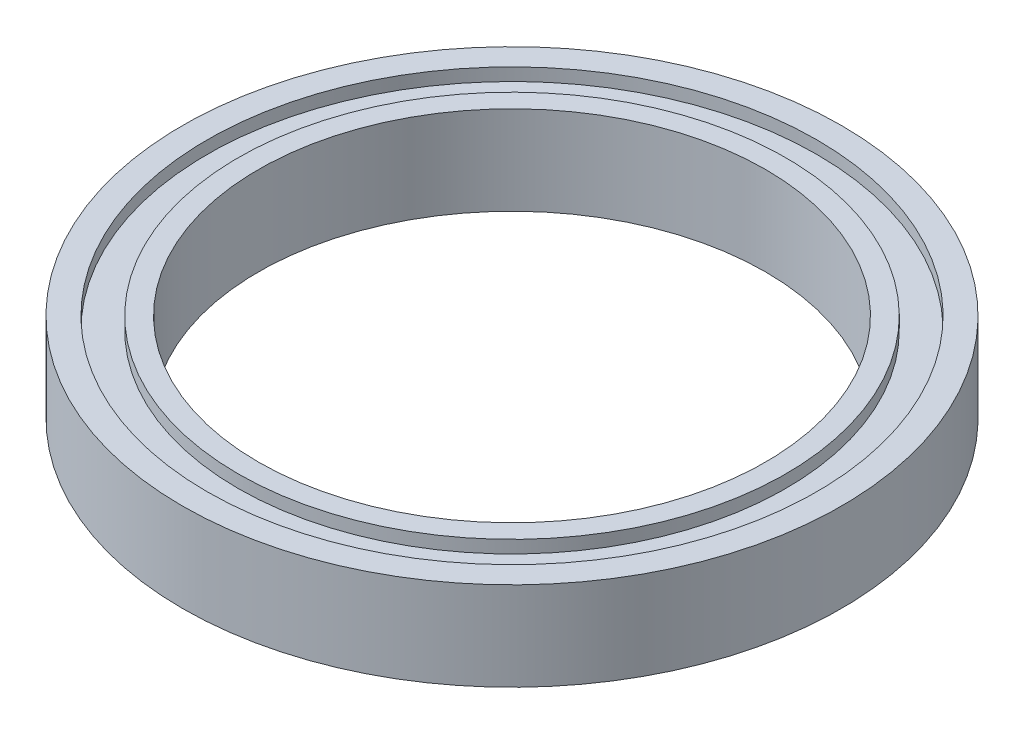
ISO-10303-21;
HEADER;
FILE_DESCRIPTION(('STEP AP214'),'2;1');
FILE_NAME('part.step','',(''),(''),'','','');
FILE_SCHEMA(('AUTOMOTIVE_DESIGN { 1 0 10303 214 1 1 1 1 }'));
ENDSEC;
DATA;
#1=APPLICATION_CONTEXT('core data for automotive mechanical design processes');
#2=APPLICATION_PROTOCOL_DEFINITION('international standard','automotive_design',2000,#1);
#3=PRODUCT_CONTEXT('',#1,'mechanical');
#4=PRODUCT('Part','Part','',(#3));
#5=PRODUCT_RELATED_PRODUCT_CATEGORY('part','',(#4));
#6=PRODUCT_DEFINITION_FORMATION('','',#4);
#7=PRODUCT_DEFINITION_CONTEXT('part definition',#1,'design');
#8=PRODUCT_DEFINITION('design','',#6,#7);
#9=PRODUCT_DEFINITION_SHAPE('','',#8);
#10=(LENGTH_UNIT() NAMED_UNIT(*) SI_UNIT(.MILLI.,.METRE.));
#11=(NAMED_UNIT(*) PLANE_ANGLE_UNIT() SI_UNIT($,.RADIAN.));
#12=(NAMED_UNIT(*) SI_UNIT($,.STERADIAN.) SOLID_ANGLE_UNIT());
#13=UNCERTAINTY_MEASURE_WITH_UNIT(LENGTH_MEASURE(1.E-05),#10,'distance_accuracy_value','');
#14=(GEOMETRIC_REPRESENTATION_CONTEXT(3) GLOBAL_UNCERTAINTY_ASSIGNED_CONTEXT((#13)) GLOBAL_UNIT_ASSIGNED_CONTEXT((#10,
#11,#12)) REPRESENTATION_CONTEXT('',''));
#15=CARTESIAN_POINT('',(0.,0.,0.));
#16=DIRECTION('',(0.,0.,1.));
#17=DIRECTION('',(1.,0.,0.));
#18=AXIS2_PLACEMENT_3D('',#15,#16,#17);
#19=CARTESIAN_POINT('',(26.,3.5,0.));
#20=DIRECTION('',(0.,-1.,0.));
#21=DIRECTION('',(0.,0.,-1.));
#22=AXIS2_PLACEMENT_3D('',#19,#20,#21);
#23=PLANE('',#22);
#24=CARTESIAN_POINT('',(0.,3.5,0.));
#25=DIRECTION('',(0.,1.,0.));
#26=DIRECTION('',(0.,0.,1.));
#27=AXIS2_PLACEMENT_3D('',#24,#25,#26);
#28=CIRCLE('',#27,24.05);
#29=CARTESIAN_POINT('',(0.,3.5,24.05));
#30=VERTEX_POINT('',#29);
#31=EDGE_CURVE('E10',#30,#30,#28,.T.);
#32=ORIENTED_EDGE('',*,*,#31,.F.);
#33=EDGE_LOOP('',(#32));
#34=FACE_BOUND('',#33,.T.);
#35=CARTESIAN_POINT('',(0.,3.5,0.));
#36=DIRECTION('',(0.,1.,0.));
#37=DIRECTION('',(0.,0.,1.));
#38=AXIS2_PLACEMENT_3D('',#35,#36,#37);
#39=CIRCLE('',#38,26.);
#40=CARTESIAN_POINT('',(0.,3.5,26.));
#41=VERTEX_POINT('',#40);
#42=EDGE_CURVE('E72',#41,#41,#39,.T.);
#43=ORIENTED_EDGE('',*,*,#42,.T.);
#44=EDGE_LOOP('',(#43));
#45=FACE_BOUND('',#44,.T.);
#46=ADVANCED_FACE('F32',(#34,#45),#23,.F.);
#47=CARTESIAN_POINT('',(0.,53.9400135687145,0.));
#48=DIRECTION('',(0.,1.,0.));
#49=DIRECTION('',(0.,0.,1.));
#50=AXIS2_PLACEMENT_3D('',#47,#48,#49);
#51=CYLINDRICAL_SURFACE('',#50,24.05);
#52=CARTESIAN_POINT('',(0.,2.5,0.));
#53=DIRECTION('',(0.,1.,0.));
#54=DIRECTION('',(0.,0.,1.));
#55=AXIS2_PLACEMENT_3D('',#52,#53,#54);
#56=CIRCLE('',#55,24.05);
#57=CARTESIAN_POINT('',(0.,2.5,24.05));
#58=VERTEX_POINT('',#57);
#59=EDGE_CURVE('E38',#58,#58,#56,.T.);
#60=ORIENTED_EDGE('',*,*,#59,.F.);
#61=EDGE_LOOP('',(#60));
#62=FACE_BOUND('',#61,.T.);
#63=ORIENTED_EDGE('',*,*,#31,.T.);
#64=EDGE_LOOP('',(#63));
#65=FACE_BOUND('',#64,.T.);
#66=ADVANCED_FACE('F133',(#62,#65),#51,.F.);
#67=CARTESIAN_POINT('',(24.05,2.5,0.));
#68=DIRECTION('',(0.,-1.,0.));
#69=DIRECTION('',(0.,0.,-1.));
#70=AXIS2_PLACEMENT_3D('',#67,#68,#69);
#71=PLANE('',#70);
#72=CARTESIAN_POINT('',(0.,2.5,0.));
#73=DIRECTION('',(0.,1.,0.));
#74=DIRECTION('',(0.,0.,1.));
#75=AXIS2_PLACEMENT_3D('',#72,#73,#74);
#76=CIRCLE('',#75,21.605);
#77=CARTESIAN_POINT('',(0.,2.5,21.605));
#78=VERTEX_POINT('',#77);
#79=EDGE_CURVE('E42',#78,#78,#76,.T.);
#80=ORIENTED_EDGE('',*,*,#79,.F.);
#81=EDGE_LOOP('',(#80));
#82=FACE_BOUND('',#81,.T.);
#83=ORIENTED_EDGE('',*,*,#59,.T.);
#84=EDGE_LOOP('',(#83));
#85=FACE_BOUND('',#84,.T.);
#86=ADVANCED_FACE('F128',(#82,#85),#71,.F.);
#87=CARTESIAN_POINT('',(0.,53.9400135687145,0.));
#88=DIRECTION('',(0.,1.,0.));
#89=DIRECTION('',(0.,0.,1.));
#90=AXIS2_PLACEMENT_3D('',#87,#88,#89);
#91=CYLINDRICAL_SURFACE('',#90,21.605);
#92=CARTESIAN_POINT('',(0.,3.5,0.));
#93=DIRECTION('',(0.,1.,0.));
#94=DIRECTION('',(0.,0.,1.));
#95=AXIS2_PLACEMENT_3D('',#92,#93,#94);
#96=CIRCLE('',#95,21.605);
#97=CARTESIAN_POINT('',(0.,3.5,21.605));
#98=VERTEX_POINT('',#97);
#99=EDGE_CURVE('E46',#98,#98,#96,.T.);
#100=ORIENTED_EDGE('',*,*,#99,.F.);
#101=EDGE_LOOP('',(#100));
#102=FACE_BOUND('',#101,.T.);
#103=ORIENTED_EDGE('',*,*,#79,.T.);
#104=EDGE_LOOP('',(#103));
#105=FACE_BOUND('',#104,.T.);
#106=ADVANCED_FACE('F122',(#102,#105),#91,.T.);
#107=CARTESIAN_POINT('',(21.605,3.5,0.));
#108=DIRECTION('',(0.,-1.,0.));
#109=DIRECTION('',(0.,0.,-1.));
#110=AXIS2_PLACEMENT_3D('',#107,#108,#109);
#111=PLANE('',#110);
#112=CARTESIAN_POINT('',(0.,3.5,0.));
#113=DIRECTION('',(0.,1.,0.));
#114=DIRECTION('',(0.,0.,1.));
#115=AXIS2_PLACEMENT_3D('',#112,#113,#114);
#116=CIRCLE('',#115,20.);
#117=CARTESIAN_POINT('',(0.,3.5,20.));
#118=VERTEX_POINT('',#117);
#119=EDGE_CURVE('E51',#118,#118,#116,.T.);
#120=ORIENTED_EDGE('',*,*,#119,.F.);
#121=EDGE_LOOP('',(#120));
#122=FACE_BOUND('',#121,.T.);
#123=ORIENTED_EDGE('',*,*,#99,.T.);
#124=EDGE_LOOP('',(#123));
#125=FACE_BOUND('',#124,.T.);
#126=ADVANCED_FACE('F116',(#122,#125),#111,.F.);
#127=CARTESIAN_POINT('',(0.,53.9400135687145,0.));
#128=DIRECTION('',(0.,1.,0.));
#129=DIRECTION('',(0.,0.,1.));
#130=AXIS2_PLACEMENT_3D('',#127,#128,#129);
#131=CYLINDRICAL_SURFACE('',#130,20.);
#132=CARTESIAN_POINT('',(0.,-3.5,0.));
#133=DIRECTION('',(0.,1.,0.));
#134=DIRECTION('',(0.,0.,1.));
#135=AXIS2_PLACEMENT_3D('',#132,#133,#134);
#136=CIRCLE('',#135,20.);
#137=CARTESIAN_POINT('',(0.,-3.5,20.));
#138=VERTEX_POINT('',#137);
#139=EDGE_CURVE('E54',#138,#138,#136,.T.);
#140=ORIENTED_EDGE('',*,*,#139,.F.);
#141=EDGE_LOOP('',(#140));
#142=FACE_BOUND('',#141,.T.);
#143=ORIENTED_EDGE('',*,*,#119,.T.);
#144=EDGE_LOOP('',(#143));
#145=FACE_BOUND('',#144,.T.);
#146=ADVANCED_FACE('F110',(#142,#145),#131,.F.);
#147=CARTESIAN_POINT('',(21.605,-3.5,0.));
#148=DIRECTION('',(0.,1.,0.));
#149=DIRECTION('',(0.,0.,1.));
#150=AXIS2_PLACEMENT_3D('',#147,#148,#149);
#151=PLANE('',#150);
#152=CARTESIAN_POINT('',(0.,-3.5,0.));
#153=DIRECTION('',(0.,1.,0.));
#154=DIRECTION('',(0.,0.,1.));
#155=AXIS2_PLACEMENT_3D('',#152,#153,#154);
#156=CIRCLE('',#155,21.605);
#157=CARTESIAN_POINT('',(0.,-3.5,21.605));
#158=VERTEX_POINT('',#157);
#159=EDGE_CURVE('E57',#158,#158,#156,.T.);
#160=ORIENTED_EDGE('',*,*,#159,.F.);
#161=EDGE_LOOP('',(#160));
#162=FACE_BOUND('',#161,.T.);
#163=ORIENTED_EDGE('',*,*,#139,.T.);
#164=EDGE_LOOP('',(#163));
#165=FACE_BOUND('',#164,.T.);
#166=ADVANCED_FACE('F104',(#162,#165),#151,.F.);
#167=CARTESIAN_POINT('',(0.,53.9400135687145,0.));
#168=DIRECTION('',(0.,1.,0.));
#169=DIRECTION('',(0.,0.,1.));
#170=AXIS2_PLACEMENT_3D('',#167,#168,#169);
#171=CYLINDRICAL_SURFACE('',#170,21.605);
#172=CARTESIAN_POINT('',(0.,-2.5,0.));
#173=DIRECTION('',(0.,1.,0.));
#174=DIRECTION('',(0.,0.,1.));
#175=AXIS2_PLACEMENT_3D('',#172,#173,#174);
#176=CIRCLE('',#175,21.605);
#177=CARTESIAN_POINT('',(0.,-2.5,21.605));
#178=VERTEX_POINT('',#177);
#179=EDGE_CURVE('E60',#178,#178,#176,.T.);
#180=ORIENTED_EDGE('',*,*,#179,.F.);
#181=EDGE_LOOP('',(#180));
#182=FACE_BOUND('',#181,.T.);
#183=ORIENTED_EDGE('',*,*,#159,.T.);
#184=EDGE_LOOP('',(#183));
#185=FACE_BOUND('',#184,.T.);
#186=ADVANCED_FACE('F98',(#182,#185),#171,.T.);
#187=CARTESIAN_POINT('',(24.05,-2.5,0.));
#188=DIRECTION('',(0.,1.,0.));
#189=DIRECTION('',(0.,0.,1.));
#190=AXIS2_PLACEMENT_3D('',#187,#188,#189);
#191=PLANE('',#190);
#192=CARTESIAN_POINT('',(0.,-2.5,0.));
#193=DIRECTION('',(0.,1.,0.));
#194=DIRECTION('',(0.,0.,1.));
#195=AXIS2_PLACEMENT_3D('',#192,#193,#194);
#196=CIRCLE('',#195,24.05);
#197=CARTESIAN_POINT('',(0.,-2.5,24.05));
#198=VERTEX_POINT('',#197);
#199=EDGE_CURVE('E63',#198,#198,#196,.T.);
#200=ORIENTED_EDGE('',*,*,#199,.F.);
#201=EDGE_LOOP('',(#200));
#202=FACE_BOUND('',#201,.T.);
#203=ORIENTED_EDGE('',*,*,#179,.T.);
#204=EDGE_LOOP('',(#203));
#205=FACE_BOUND('',#204,.T.);
#206=ADVANCED_FACE('F92',(#202,#205),#191,.F.);
#207=CARTESIAN_POINT('',(0.,53.9400135687145,0.));
#208=DIRECTION('',(0.,1.,0.));
#209=DIRECTION('',(0.,0.,1.));
#210=AXIS2_PLACEMENT_3D('',#207,#208,#209);
#211=CYLINDRICAL_SURFACE('',#210,24.05);
#212=CARTESIAN_POINT('',(0.,-3.5,0.));
#213=DIRECTION('',(0.,1.,0.));
#214=DIRECTION('',(0.,0.,1.));
#215=AXIS2_PLACEMENT_3D('',#212,#213,#214);
#216=CIRCLE('',#215,24.05);
#217=CARTESIAN_POINT('',(0.,-3.5,24.05));
#218=VERTEX_POINT('',#217);
#219=EDGE_CURVE('E66',#218,#218,#216,.T.);
#220=ORIENTED_EDGE('',*,*,#219,.F.);
#221=EDGE_LOOP('',(#220));
#222=FACE_BOUND('',#221,.T.);
#223=ORIENTED_EDGE('',*,*,#199,.T.);
#224=EDGE_LOOP('',(#223));
#225=FACE_BOUND('',#224,.T.);
#226=ADVANCED_FACE('F86',(#222,#225),#211,.F.);
#227=CARTESIAN_POINT('',(26.,-3.5,0.));
#228=DIRECTION('',(0.,1.,0.));
#229=DIRECTION('',(0.,0.,1.));
#230=AXIS2_PLACEMENT_3D('',#227,#228,#229);
#231=PLANE('',#230);
#232=CARTESIAN_POINT('',(0.,-3.5,0.));
#233=DIRECTION('',(0.,1.,0.));
#234=DIRECTION('',(0.,0.,1.));
#235=AXIS2_PLACEMENT_3D('',#232,#233,#234);
#236=CIRCLE('',#235,26.);
#237=CARTESIAN_POINT('',(0.,-3.5,26.));
#238=VERTEX_POINT('',#237);
#239=EDGE_CURVE('E69',#238,#238,#236,.T.);
#240=ORIENTED_EDGE('',*,*,#239,.F.);
#241=EDGE_LOOP('',(#240));
#242=FACE_BOUND('',#241,.T.);
#243=ORIENTED_EDGE('',*,*,#219,.T.);
#244=EDGE_LOOP('',(#243));
#245=FACE_BOUND('',#244,.T.);
#246=ADVANCED_FACE('F80',(#242,#245),#231,.F.);
#247=CARTESIAN_POINT('',(0.,53.9400135687145,0.));
#248=DIRECTION('',(0.,1.,0.));
#249=DIRECTION('',(0.,0.,1.));
#250=AXIS2_PLACEMENT_3D('',#247,#248,#249);
#251=CYLINDRICAL_SURFACE('',#250,26.);
#252=ORIENTED_EDGE('',*,*,#42,.F.);
#253=EDGE_LOOP('',(#252));
#254=FACE_BOUND('',#253,.T.);
#255=ORIENTED_EDGE('',*,*,#239,.T.);
#256=EDGE_LOOP('',(#255));
#257=FACE_BOUND('',#256,.T.);
#258=ADVANCED_FACE('F77',(#254,#257),#251,.T.);
#259=CLOSED_SHELL('',(#46,#66,#86,#106,#126,#146,#166,#186,#206,#226,#246,#258));
#260=MANIFOLD_SOLID_BREP('B2',#259);
#261=ADVANCED_BREP_SHAPE_REPRESENTATION('',(#18,#260),#14);
#262=SHAPE_DEFINITION_REPRESENTATION(#9,#261);
ENDSEC;
END-ISO-10303-21;
